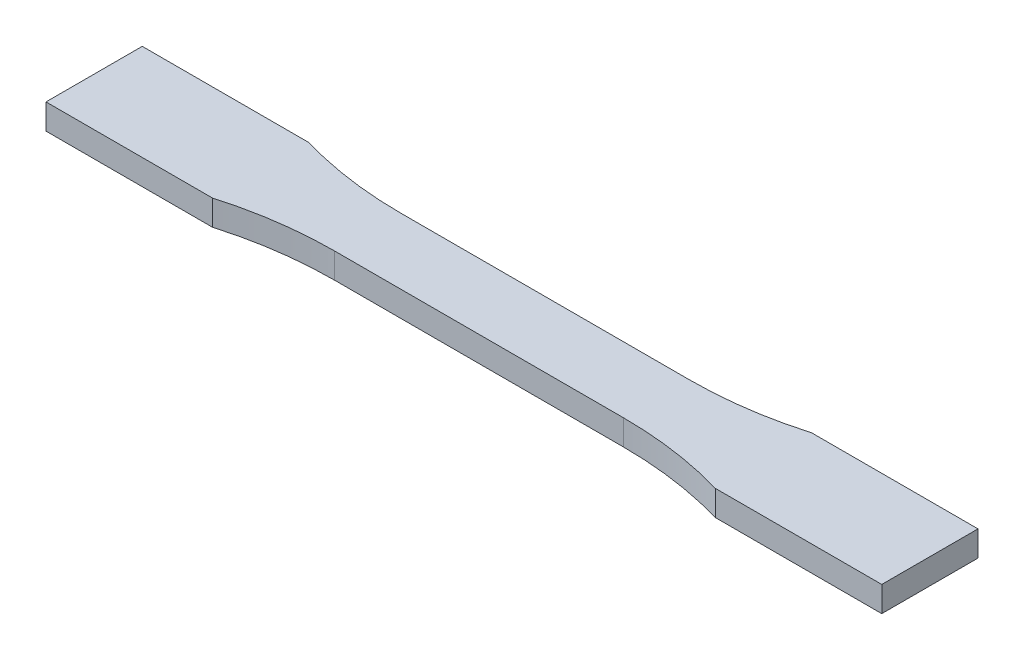
ISO-10303-21;
HEADER;
FILE_DESCRIPTION(('STEP AP214'),'2;1');
FILE_NAME('part.step','',(''),(''),'','','');
FILE_SCHEMA(('AUTOMOTIVE_DESIGN { 1 0 10303 214 1 1 1 1 }'));
ENDSEC;
DATA;
#1=APPLICATION_CONTEXT('core data for automotive mechanical design processes');
#2=APPLICATION_PROTOCOL_DEFINITION('international standard','automotive_design',2000,#1);
#3=PRODUCT_CONTEXT('',#1,'mechanical');
#4=PRODUCT('Part','Part','',(#3));
#5=PRODUCT_RELATED_PRODUCT_CATEGORY('part','',(#4));
#6=PRODUCT_DEFINITION_FORMATION('','',#4);
#7=PRODUCT_DEFINITION_CONTEXT('part definition',#1,'design');
#8=PRODUCT_DEFINITION('design','',#6,#7);
#9=PRODUCT_DEFINITION_SHAPE('','',#8);
#10=(LENGTH_UNIT() NAMED_UNIT(*) SI_UNIT(.MILLI.,.METRE.));
#11=(NAMED_UNIT(*) PLANE_ANGLE_UNIT() SI_UNIT($,.RADIAN.));
#12=(NAMED_UNIT(*) SI_UNIT($,.STERADIAN.) SOLID_ANGLE_UNIT());
#13=UNCERTAINTY_MEASURE_WITH_UNIT(LENGTH_MEASURE(1.E-05),#10,'distance_accuracy_value','');
#14=(GEOMETRIC_REPRESENTATION_CONTEXT(3) GLOBAL_UNCERTAINTY_ASSIGNED_CONTEXT((#13)) GLOBAL_UNIT_ASSIGNED_CONTEXT((#10,
#11,#12)) REPRESENTATION_CONTEXT('',''));
#15=CARTESIAN_POINT('',(0.,0.,0.));
#16=DIRECTION('',(0.,0.,1.));
#17=DIRECTION('',(1.,0.,0.));
#18=AXIS2_PLACEMENT_3D('',#15,#16,#17);
#19=CARTESIAN_POINT('',(0.,2.5,9.50000000000007));
#20=DIRECTION('',(0.,0.,1.));
#21=DIRECTION('',(1.,0.,0.));
#22=AXIS2_PLACEMENT_3D('',#19,#20,#21);
#23=PLANE('',#22);
#24=DIRECTION('',(-1.,0.,0.));
#25=VECTOR('',#24,1.);
#26=CARTESIAN_POINT('',(0.,-2.5,9.50000000000007));
#27=LINE('',#26,#25);
#28=CARTESIAN_POINT('',(-49.642374511866,-2.5,9.50000000000003));
#29=VERTEX_POINT('',#28);
#30=CARTESIAN_POINT('',(-82.5,-2.5,9.5));
#31=VERTEX_POINT('',#30);
#32=EDGE_CURVE('E152',#29,#31,#27,.T.);
#33=ORIENTED_EDGE('',*,*,#32,.F.);
#34=DIRECTION('',(0.,-1.,0.));
#35=VECTOR('',#34,1.);
#36=CARTESIAN_POINT('',(-49.642374511866,2.5,9.50000000000003));
#37=LINE('',#36,#35);
#38=CARTESIAN_POINT('',(-49.642374511866,2.5,9.50000000000003));
#39=VERTEX_POINT('',#38);
#40=EDGE_CURVE('E11',#39,#29,#37,.T.);
#41=ORIENTED_EDGE('',*,*,#40,.F.);
#42=DIRECTION('',(-1.,0.,0.));
#43=VECTOR('',#42,1.);
#44=CARTESIAN_POINT('',(0.,2.5,9.50000000000007));
#45=LINE('',#44,#43);
#46=CARTESIAN_POINT('',(-82.5,2.5,9.5));
#47=VERTEX_POINT('',#46);
#48=EDGE_CURVE('E182',#39,#47,#45,.T.);
#49=ORIENTED_EDGE('',*,*,#48,.T.);
#50=DIRECTION('',(0.,-1.,0.));
#51=VECTOR('',#50,1.);
#52=CARTESIAN_POINT('',(-82.5,2.5,9.5));
#53=LINE('',#52,#51);
#54=EDGE_CURVE('E96',#47,#31,#53,.T.);
#55=ORIENTED_EDGE('',*,*,#54,.T.);
#56=EDGE_LOOP('',(#33,#41,#49,#55));
#57=FACE_BOUND('',#56,.T.);
#58=ADVANCED_FACE('F34',(#57),#23,.T.);
#59=CARTESIAN_POINT('',(-28.5,2.5,82.5));
#60=DIRECTION('',(0.,-1.,0.));
#61=DIRECTION('',(0.,0.,-1.));
#62=AXIS2_PLACEMENT_3D('',#59,#60,#61);
#63=CYLINDRICAL_SURFACE('',#62,76.);
#64=CARTESIAN_POINT('',(-28.5,-2.5,82.5));
#65=DIRECTION('',(0.,1.,0.));
#66=DIRECTION('',(0.,0.,1.));
#67=AXIS2_PLACEMENT_3D('',#64,#65,#66);
#68=CIRCLE('',#67,76.);
#69=CARTESIAN_POINT('',(-28.5,-2.5,6.5));
#70=VERTEX_POINT('',#69);
#71=EDGE_CURVE('E155',#29,#70,#68,.F.);
#72=ORIENTED_EDGE('',*,*,#71,.T.);
#73=DIRECTION('',(0.,-1.,0.));
#74=VECTOR('',#73,1.);
#75=CARTESIAN_POINT('',(-28.5,2.5,6.5));
#76=LINE('',#75,#74);
#77=CARTESIAN_POINT('',(-28.5,2.5,6.5));
#78=VERTEX_POINT('',#77);
#79=EDGE_CURVE('E42',#78,#70,#76,.T.);
#80=ORIENTED_EDGE('',*,*,#79,.F.);
#81=CARTESIAN_POINT('',(-28.5,2.5,82.5));
#82=DIRECTION('',(0.,1.,0.));
#83=DIRECTION('',(0.,0.,1.));
#84=AXIS2_PLACEMENT_3D('',#81,#82,#83);
#85=CIRCLE('',#84,76.);
#86=EDGE_CURVE('E221',#39,#78,#85,.F.);
#87=ORIENTED_EDGE('',*,*,#86,.F.);
#88=ORIENTED_EDGE('',*,*,#40,.T.);
#89=EDGE_LOOP('',(#72,#80,#87,#88));
#90=FACE_BOUND('',#89,.T.);
#91=ADVANCED_FACE('F243',(#90),#63,.F.);
#92=CARTESIAN_POINT('',(0.,2.5,6.5));
#93=DIRECTION('',(0.,0.,-1.));
#94=DIRECTION('',(-1.,0.,0.));
#95=AXIS2_PLACEMENT_3D('',#92,#93,#94);
#96=PLANE('',#95);
#97=DIRECTION('',(1.,0.,0.));
#98=VECTOR('',#97,1.);
#99=CARTESIAN_POINT('',(0.,-2.5,6.5));
#100=LINE('',#99,#98);
#101=CARTESIAN_POINT('',(28.5,-2.5,6.5));
#102=VERTEX_POINT('',#101);
#103=EDGE_CURVE('E157',#70,#102,#100,.T.);
#104=ORIENTED_EDGE('',*,*,#103,.T.);
#105=DIRECTION('',(0.,-1.,0.));
#106=VECTOR('',#105,1.);
#107=CARTESIAN_POINT('',(28.5,2.5,6.5));
#108=LINE('',#107,#106);
#109=CARTESIAN_POINT('',(28.5,2.5,6.5));
#110=VERTEX_POINT('',#109);
#111=EDGE_CURVE('E196',#110,#102,#108,.T.);
#112=ORIENTED_EDGE('',*,*,#111,.F.);
#113=DIRECTION('',(1.,0.,0.));
#114=VECTOR('',#113,1.);
#115=CARTESIAN_POINT('',(0.,2.5,6.5));
#116=LINE('',#115,#114);
#117=EDGE_CURVE('E204',#78,#110,#116,.T.);
#118=ORIENTED_EDGE('',*,*,#117,.F.);
#119=ORIENTED_EDGE('',*,*,#79,.T.);
#120=EDGE_LOOP('',(#104,#112,#118,#119));
#121=FACE_BOUND('',#120,.T.);
#122=ADVANCED_FACE('F202',(#121),#96,.F.);
#123=CARTESIAN_POINT('',(28.5,2.5,82.5));
#124=DIRECTION('',(0.,-1.,0.));
#125=DIRECTION('',(0.,0.,-1.));
#126=AXIS2_PLACEMENT_3D('',#123,#124,#125);
#127=CYLINDRICAL_SURFACE('',#126,76.);
#128=CARTESIAN_POINT('',(28.5,-2.5,82.5));
#129=DIRECTION('',(0.,1.,0.));
#130=DIRECTION('',(0.,0.,1.));
#131=AXIS2_PLACEMENT_3D('',#128,#129,#130);
#132=CIRCLE('',#131,76.);
#133=CARTESIAN_POINT('',(49.642374511866,-2.5,9.50000000000002));
#134=VERTEX_POINT('',#133);
#135=EDGE_CURVE('E160',#134,#102,#132,.T.);
#136=ORIENTED_EDGE('',*,*,#135,.F.);
#137=DIRECTION('',(0.,-1.,0.));
#138=VECTOR('',#137,1.);
#139=CARTESIAN_POINT('',(49.642374511866,2.5,9.50000000000002));
#140=LINE('',#139,#138);
#141=CARTESIAN_POINT('',(49.642374511866,2.5,9.50000000000002));
#142=VERTEX_POINT('',#141);
#143=EDGE_CURVE('E194',#142,#134,#140,.T.);
#144=ORIENTED_EDGE('',*,*,#143,.F.);
#145=CARTESIAN_POINT('',(28.5,2.5,82.5));
#146=DIRECTION('',(0.,1.,0.));
#147=DIRECTION('',(0.,0.,1.));
#148=AXIS2_PLACEMENT_3D('',#145,#146,#147);
#149=CIRCLE('',#148,76.);
#150=EDGE_CURVE('E216',#142,#110,#149,.T.);
#151=ORIENTED_EDGE('',*,*,#150,.T.);
#152=ORIENTED_EDGE('',*,*,#111,.T.);
#153=EDGE_LOOP('',(#136,#144,#151,#152));
#154=FACE_BOUND('',#153,.T.);
#155=ADVANCED_FACE('F212',(#154),#127,.F.);
#156=CARTESIAN_POINT('',(0.,2.5,9.50000000000004));
#157=DIRECTION('',(0.,0.,-1.));
#158=DIRECTION('',(-1.,0.,0.));
#159=AXIS2_PLACEMENT_3D('',#156,#157,#158);
#160=PLANE('',#159);
#161=DIRECTION('',(1.,0.,0.));
#162=VECTOR('',#161,1.);
#163=CARTESIAN_POINT('',(0.,-2.5,9.50000000000004));
#164=LINE('',#163,#162);
#165=CARTESIAN_POINT('',(82.5,-2.5,9.5));
#166=VERTEX_POINT('',#165);
#167=EDGE_CURVE('E163',#134,#166,#164,.T.);
#168=ORIENTED_EDGE('',*,*,#167,.T.);
#169=DIRECTION('',(0.,-1.,0.));
#170=VECTOR('',#169,1.);
#171=CARTESIAN_POINT('',(82.5,2.5,9.5));
#172=LINE('',#171,#170);
#173=CARTESIAN_POINT('',(82.5,2.5,9.5));
#174=VERTEX_POINT('',#173);
#175=EDGE_CURVE('E192',#174,#166,#172,.T.);
#176=ORIENTED_EDGE('',*,*,#175,.F.);
#177=DIRECTION('',(1.,0.,0.));
#178=VECTOR('',#177,1.);
#179=CARTESIAN_POINT('',(0.,2.5,9.50000000000004));
#180=LINE('',#179,#178);
#181=EDGE_CURVE('E217',#142,#174,#180,.T.);
#182=ORIENTED_EDGE('',*,*,#181,.F.);
#183=ORIENTED_EDGE('',*,*,#143,.T.);
#184=EDGE_LOOP('',(#168,#176,#182,#183));
#185=FACE_BOUND('',#184,.T.);
#186=ADVANCED_FACE('F253',(#185),#160,.F.);
#187=CARTESIAN_POINT('',(82.5,2.5,0.));
#188=DIRECTION('',(1.,0.,0.));
#189=DIRECTION('',(0.,0.,-1.));
#190=AXIS2_PLACEMENT_3D('',#187,#188,#189);
#191=PLANE('',#190);
#192=DIRECTION('',(0.,0.,1.));
#193=VECTOR('',#192,1.);
#194=CARTESIAN_POINT('',(82.5,-2.5,0.));
#195=LINE('',#194,#193);
#196=CARTESIAN_POINT('',(82.5,-2.5,-9.5));
#197=VERTEX_POINT('',#196);
#198=EDGE_CURVE('E166',#197,#166,#195,.T.);
#199=ORIENTED_EDGE('',*,*,#198,.F.);
#200=DIRECTION('',(0.,-1.,0.));
#201=VECTOR('',#200,1.);
#202=CARTESIAN_POINT('',(82.5,2.5,-9.5));
#203=LINE('',#202,#201);
#204=CARTESIAN_POINT('',(82.5,2.5,-9.5));
#205=VERTEX_POINT('',#204);
#206=EDGE_CURVE('E190',#205,#197,#203,.T.);
#207=ORIENTED_EDGE('',*,*,#206,.F.);
#208=DIRECTION('',(0.,0.,1.));
#209=VECTOR('',#208,1.);
#210=CARTESIAN_POINT('',(82.5,2.5,0.));
#211=LINE('',#210,#209);
#212=EDGE_CURVE('E219',#205,#174,#211,.T.);
#213=ORIENTED_EDGE('',*,*,#212,.T.);
#214=ORIENTED_EDGE('',*,*,#175,.T.);
#215=EDGE_LOOP('',(#199,#207,#213,#214));
#216=FACE_BOUND('',#215,.T.);
#217=ADVANCED_FACE('F256',(#216),#191,.T.);
#218=CARTESIAN_POINT('',(0.,2.5,-9.50000000000004));
#219=DIRECTION('',(0.,0.,-1.));
#220=DIRECTION('',(-1.,0.,0.));
#221=AXIS2_PLACEMENT_3D('',#218,#219,#220);
#222=PLANE('',#221);
#223=DIRECTION('',(1.,0.,0.));
#224=VECTOR('',#223,1.);
#225=CARTESIAN_POINT('',(0.,-2.5,-9.50000000000004));
#226=LINE('',#225,#224);
#227=CARTESIAN_POINT('',(49.642374511866,-2.5,-9.50000000000002));
#228=VERTEX_POINT('',#227);
#229=EDGE_CURVE('E169',#228,#197,#226,.T.);
#230=ORIENTED_EDGE('',*,*,#229,.F.);
#231=DIRECTION('',(0.,-1.,0.));
#232=VECTOR('',#231,1.);
#233=CARTESIAN_POINT('',(49.642374511866,2.5,-9.50000000000002));
#234=LINE('',#233,#232);
#235=CARTESIAN_POINT('',(49.642374511866,2.5,-9.50000000000002));
#236=VERTEX_POINT('',#235);
#237=EDGE_CURVE('E188',#236,#228,#234,.T.);
#238=ORIENTED_EDGE('',*,*,#237,.F.);
#239=DIRECTION('',(1.,0.,0.));
#240=VECTOR('',#239,1.);
#241=CARTESIAN_POINT('',(0.,2.5,-9.50000000000004));
#242=LINE('',#241,#240);
#243=EDGE_CURVE('E227',#236,#205,#242,.T.);
#244=ORIENTED_EDGE('',*,*,#243,.T.);
#245=ORIENTED_EDGE('',*,*,#206,.T.);
#246=EDGE_LOOP('',(#230,#238,#244,#245));
#247=FACE_BOUND('',#246,.T.);
#248=ADVANCED_FACE('F260',(#247),#222,.T.);
#249=CARTESIAN_POINT('',(28.5,2.5,-82.5));
#250=DIRECTION('',(0.,-1.,0.));
#251=DIRECTION('',(0.,0.,-1.));
#252=AXIS2_PLACEMENT_3D('',#249,#250,#251);
#253=CYLINDRICAL_SURFACE('',#252,76.);
#254=CARTESIAN_POINT('',(28.5,-2.5,-82.5));
#255=DIRECTION('',(0.,1.,0.));
#256=DIRECTION('',(0.,0.,1.));
#257=AXIS2_PLACEMENT_3D('',#254,#255,#256);
#258=CIRCLE('',#257,76.);
#259=CARTESIAN_POINT('',(28.5,-2.5,-6.5));
#260=VERTEX_POINT('',#259);
#261=EDGE_CURVE('E172',#228,#260,#258,.F.);
#262=ORIENTED_EDGE('',*,*,#261,.T.);
#263=DIRECTION('',(0.,-1.,0.));
#264=VECTOR('',#263,1.);
#265=CARTESIAN_POINT('',(28.5,2.5,-6.5));
#266=LINE('',#265,#264);
#267=CARTESIAN_POINT('',(28.5,2.5,-6.5));
#268=VERTEX_POINT('',#267);
#269=EDGE_CURVE('E186',#268,#260,#266,.T.);
#270=ORIENTED_EDGE('',*,*,#269,.F.);
#271=CARTESIAN_POINT('',(28.5,2.5,-82.5));
#272=DIRECTION('',(0.,1.,0.));
#273=DIRECTION('',(0.,0.,1.));
#274=AXIS2_PLACEMENT_3D('',#271,#272,#273);
#275=CIRCLE('',#274,76.);
#276=EDGE_CURVE('E147',#236,#268,#275,.F.);
#277=ORIENTED_EDGE('',*,*,#276,.F.);
#278=ORIENTED_EDGE('',*,*,#237,.T.);
#279=EDGE_LOOP('',(#262,#270,#277,#278));
#280=FACE_BOUND('',#279,.T.);
#281=ADVANCED_FACE('F234',(#280),#253,.F.);
#282=CARTESIAN_POINT('',(0.,2.5,-6.5));
#283=DIRECTION('',(0.,0.,-1.));
#284=DIRECTION('',(-1.,0.,0.));
#285=AXIS2_PLACEMENT_3D('',#282,#283,#284);
#286=PLANE('',#285);
#287=DIRECTION('',(1.,0.,0.));
#288=VECTOR('',#287,1.);
#289=CARTESIAN_POINT('',(0.,-2.5,-6.5));
#290=LINE('',#289,#288);
#291=CARTESIAN_POINT('',(-28.5,-2.5,-6.5));
#292=VERTEX_POINT('',#291);
#293=EDGE_CURVE('E175',#292,#260,#290,.T.);
#294=ORIENTED_EDGE('',*,*,#293,.F.);
#295=DIRECTION('',(0.,-1.,0.));
#296=VECTOR('',#295,1.);
#297=CARTESIAN_POINT('',(-28.5,2.5,-6.5));
#298=LINE('',#297,#296);
#299=CARTESIAN_POINT('',(-28.5,2.5,-6.5));
#300=VERTEX_POINT('',#299);
#301=EDGE_CURVE('E136',#300,#292,#298,.T.);
#302=ORIENTED_EDGE('',*,*,#301,.F.);
#303=DIRECTION('',(1.,0.,0.));
#304=VECTOR('',#303,1.);
#305=CARTESIAN_POINT('',(0.,2.5,-6.5));
#306=LINE('',#305,#304);
#307=EDGE_CURVE('E145',#300,#268,#306,.T.);
#308=ORIENTED_EDGE('',*,*,#307,.T.);
#309=ORIENTED_EDGE('',*,*,#269,.T.);
#310=EDGE_LOOP('',(#294,#302,#308,#309));
#311=FACE_BOUND('',#310,.T.);
#312=ADVANCED_FACE('F238',(#311),#286,.T.);
#313=CARTESIAN_POINT('',(-28.5,2.5,-82.5));
#314=DIRECTION('',(0.,-1.,0.));
#315=DIRECTION('',(0.,0.,-1.));
#316=AXIS2_PLACEMENT_3D('',#313,#314,#315);
#317=CYLINDRICAL_SURFACE('',#316,76.);
#318=CARTESIAN_POINT('',(-28.5,-2.5,-82.5));
#319=DIRECTION('',(0.,1.,0.));
#320=DIRECTION('',(0.,0.,1.));
#321=AXIS2_PLACEMENT_3D('',#318,#319,#320);
#322=CIRCLE('',#321,76.);
#323=CARTESIAN_POINT('',(-49.642374511866,-2.5,-9.5));
#324=VERTEX_POINT('',#323);
#325=EDGE_CURVE('E135',#324,#292,#322,.T.);
#326=ORIENTED_EDGE('',*,*,#325,.F.);
#327=DIRECTION('',(0.,-1.,0.));
#328=VECTOR('',#327,1.);
#329=CARTESIAN_POINT('',(-49.642374511866,2.5,-9.5));
#330=LINE('',#329,#328);
#331=CARTESIAN_POINT('',(-49.642374511866,2.5,-9.5));
#332=VERTEX_POINT('',#331);
#333=EDGE_CURVE('E129',#332,#324,#330,.T.);
#334=ORIENTED_EDGE('',*,*,#333,.F.);
#335=CARTESIAN_POINT('',(-28.5,2.5,-82.5));
#336=DIRECTION('',(0.,1.,0.));
#337=DIRECTION('',(0.,0.,1.));
#338=AXIS2_PLACEMENT_3D('',#335,#336,#337);
#339=CIRCLE('',#338,76.);
#340=EDGE_CURVE('E133',#332,#300,#339,.T.);
#341=ORIENTED_EDGE('',*,*,#340,.T.);
#342=ORIENTED_EDGE('',*,*,#301,.T.);
#343=EDGE_LOOP('',(#326,#334,#341,#342));
#344=FACE_BOUND('',#343,.T.);
#345=ADVANCED_FACE('F131',(#344),#317,.F.);
#346=CARTESIAN_POINT('',(0.,2.5,-9.50000000000001));
#347=DIRECTION('',(0.,0.,1.));
#348=DIRECTION('',(1.,0.,0.));
#349=AXIS2_PLACEMENT_3D('',#346,#347,#348);
#350=PLANE('',#349);
#351=DIRECTION('',(-1.,0.,0.));
#352=VECTOR('',#351,1.);
#353=CARTESIAN_POINT('',(0.,-2.5,-9.50000000000001));
#354=LINE('',#353,#352);
#355=CARTESIAN_POINT('',(-82.5,-2.5,-9.5));
#356=VERTEX_POINT('',#355);
#357=EDGE_CURVE('E89',#324,#356,#354,.T.);
#358=ORIENTED_EDGE('',*,*,#357,.T.);
#359=DIRECTION('',(0.,-1.,0.));
#360=VECTOR('',#359,1.);
#361=CARTESIAN_POINT('',(-82.5,2.5,-9.5));
#362=LINE('',#361,#360);
#363=CARTESIAN_POINT('',(-82.5,2.5,-9.5));
#364=VERTEX_POINT('',#363);
#365=EDGE_CURVE('E137',#364,#356,#362,.T.);
#366=ORIENTED_EDGE('',*,*,#365,.F.);
#367=DIRECTION('',(-1.,0.,0.));
#368=VECTOR('',#367,1.);
#369=CARTESIAN_POINT('',(0.,2.5,-9.50000000000001));
#370=LINE('',#369,#368);
#371=EDGE_CURVE('E139',#332,#364,#370,.T.);
#372=ORIENTED_EDGE('',*,*,#371,.F.);
#373=ORIENTED_EDGE('',*,*,#333,.T.);
#374=EDGE_LOOP('',(#358,#366,#372,#373));
#375=FACE_BOUND('',#374,.T.);
#376=ADVANCED_FACE('F140',(#375),#350,.F.);
#377=CARTESIAN_POINT('',(-82.5,2.5,0.));
#378=DIRECTION('',(1.,0.,0.));
#379=DIRECTION('',(0.,0.,-1.));
#380=AXIS2_PLACEMENT_3D('',#377,#378,#379);
#381=PLANE('',#380);
#382=DIRECTION('',(0.,0.,1.));
#383=VECTOR('',#382,1.);
#384=CARTESIAN_POINT('',(-82.5,-2.5,0.));
#385=LINE('',#384,#383);
#386=EDGE_CURVE('E180',#356,#31,#385,.T.);
#387=ORIENTED_EDGE('',*,*,#386,.T.);
#388=ORIENTED_EDGE('',*,*,#54,.F.);
#389=DIRECTION('',(0.,0.,1.));
#390=VECTOR('',#389,1.);
#391=CARTESIAN_POINT('',(-82.5,2.5,0.));
#392=LINE('',#391,#390);
#393=EDGE_CURVE('E50',#364,#47,#392,.T.);
#394=ORIENTED_EDGE('',*,*,#393,.F.);
#395=ORIENTED_EDGE('',*,*,#365,.T.);
#396=EDGE_LOOP('',(#387,#388,#394,#395));
#397=FACE_BOUND('',#396,.T.);
#398=ADVANCED_FACE('F241',(#397),#381,.F.);
#399=CARTESIAN_POINT('',(0.,2.5,0.));
#400=DIRECTION('',(0.,1.,0.));
#401=DIRECTION('',(0.,0.,1.));
#402=AXIS2_PLACEMENT_3D('',#399,#400,#401);
#403=PLANE('',#402);
#404=ORIENTED_EDGE('',*,*,#48,.F.);
#405=ORIENTED_EDGE('',*,*,#86,.T.);
#406=ORIENTED_EDGE('',*,*,#117,.T.);
#407=ORIENTED_EDGE('',*,*,#150,.F.);
#408=ORIENTED_EDGE('',*,*,#181,.T.);
#409=ORIENTED_EDGE('',*,*,#212,.F.);
#410=ORIENTED_EDGE('',*,*,#243,.F.);
#411=ORIENTED_EDGE('',*,*,#276,.T.);
#412=ORIENTED_EDGE('',*,*,#307,.F.);
#413=ORIENTED_EDGE('',*,*,#340,.F.);
#414=ORIENTED_EDGE('',*,*,#371,.T.);
#415=ORIENTED_EDGE('',*,*,#393,.T.);
#416=EDGE_LOOP('',(#404,#405,#406,#407,#408,#409,#410,#411,#412,#413,#414,#415));
#417=FACE_BOUND('',#416,.T.);
#418=ADVANCED_FACE('F143',(#417),#403,.T.);
#419=CARTESIAN_POINT('',(0.,-2.5,0.));
#420=DIRECTION('',(0.,1.,0.));
#421=DIRECTION('',(0.,0.,1.));
#422=AXIS2_PLACEMENT_3D('',#419,#420,#421);
#423=PLANE('',#422);
#424=ORIENTED_EDGE('',*,*,#32,.T.);
#425=ORIENTED_EDGE('',*,*,#386,.F.);
#426=ORIENTED_EDGE('',*,*,#357,.F.);
#427=ORIENTED_EDGE('',*,*,#325,.T.);
#428=ORIENTED_EDGE('',*,*,#293,.T.);
#429=ORIENTED_EDGE('',*,*,#261,.F.);
#430=ORIENTED_EDGE('',*,*,#229,.T.);
#431=ORIENTED_EDGE('',*,*,#198,.T.);
#432=ORIENTED_EDGE('',*,*,#167,.F.);
#433=ORIENTED_EDGE('',*,*,#135,.T.);
#434=ORIENTED_EDGE('',*,*,#103,.F.);
#435=ORIENTED_EDGE('',*,*,#71,.F.);
#436=EDGE_LOOP('',(#424,#425,#426,#427,#428,#429,#430,#431,#432,#433,#434,#435));
#437=FACE_BOUND('',#436,.T.);
#438=ADVANCED_FACE('F208',(#437),#423,.F.);
#439=CLOSED_SHELL('',(#58,#91,#122,#155,#186,#217,#248,#281,#312,#345,#376,#398,#418,#438));
#440=MANIFOLD_SOLID_BREP('B2',#439);
#441=ADVANCED_BREP_SHAPE_REPRESENTATION('',(#18,#440),#14);
#442=SHAPE_DEFINITION_REPRESENTATION(#9,#441);
ENDSEC;
END-ISO-10303-21;
